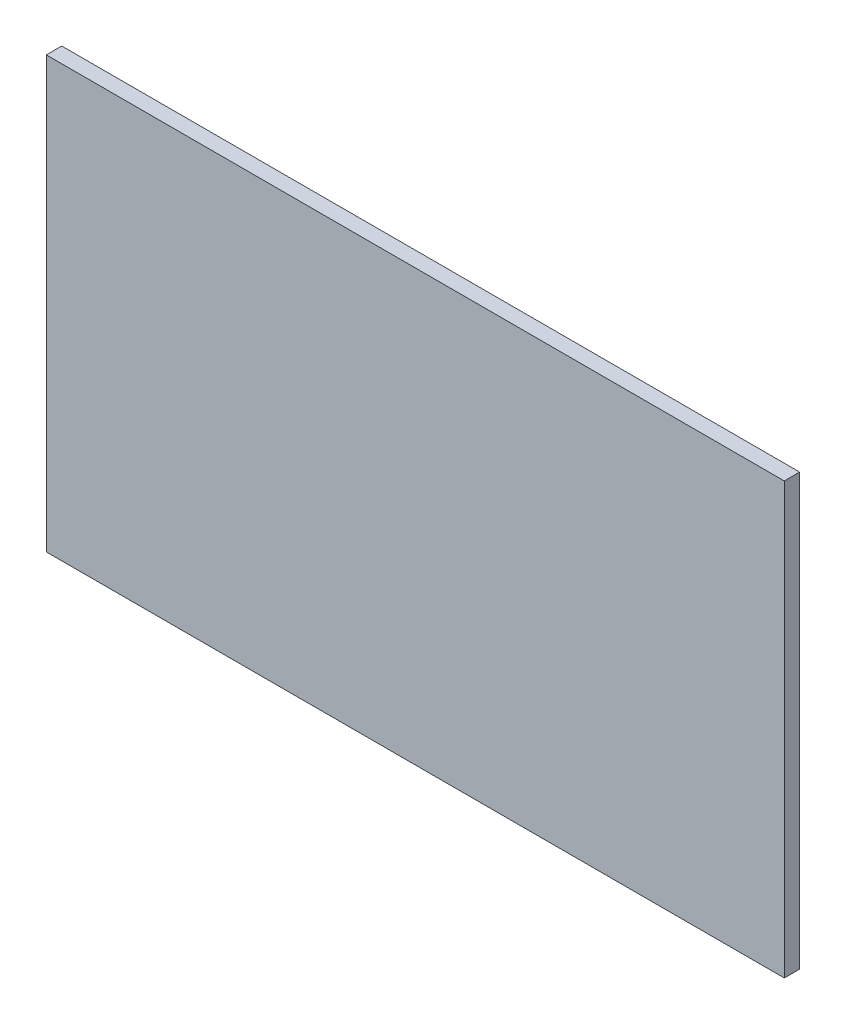
ISO-10303-21;
HEADER;
FILE_DESCRIPTION(('STEP AP214'),'2;1');
FILE_NAME('part.step','',(''),(''),'','','');
FILE_SCHEMA(('AUTOMOTIVE_DESIGN { 1 0 10303 214 1 1 1 1 }'));
ENDSEC;
DATA;
#1=APPLICATION_CONTEXT('core data for automotive mechanical design processes');
#2=APPLICATION_PROTOCOL_DEFINITION('international standard','automotive_design',2000,#1);
#3=PRODUCT_CONTEXT('',#1,'mechanical');
#4=PRODUCT('Part','Part','',(#3));
#5=PRODUCT_RELATED_PRODUCT_CATEGORY('part','',(#4));
#6=PRODUCT_DEFINITION_FORMATION('','',#4);
#7=PRODUCT_DEFINITION_CONTEXT('part definition',#1,'design');
#8=PRODUCT_DEFINITION('design','',#6,#7);
#9=PRODUCT_DEFINITION_SHAPE('','',#8);
#10=(LENGTH_UNIT() NAMED_UNIT(*) SI_UNIT(.MILLI.,.METRE.));
#11=(NAMED_UNIT(*) PLANE_ANGLE_UNIT() SI_UNIT($,.RADIAN.));
#12=(NAMED_UNIT(*) SI_UNIT($,.STERADIAN.) SOLID_ANGLE_UNIT());
#13=UNCERTAINTY_MEASURE_WITH_UNIT(LENGTH_MEASURE(1.E-05),#10,'distance_accuracy_value','');
#14=(GEOMETRIC_REPRESENTATION_CONTEXT(3) GLOBAL_UNCERTAINTY_ASSIGNED_CONTEXT((#13)) GLOBAL_UNIT_ASSIGNED_CONTEXT((#10,
#11,#12)) REPRESENTATION_CONTEXT('',''));
#15=CARTESIAN_POINT('',(0.,0.,0.));
#16=DIRECTION('',(0.,0.,1.));
#17=DIRECTION('',(1.,0.,0.));
#18=AXIS2_PLACEMENT_3D('',#15,#16,#17);
#19=CARTESIAN_POINT('',(0.,0.,30.));
#20=DIRECTION('',(1.,0.,0.));
#21=DIRECTION('',(0.,0.,-1.));
#22=AXIS2_PLACEMENT_3D('',#19,#20,#21);
#23=PLANE('',#22);
#24=DIRECTION('',(0.,-1.,0.));
#25=VECTOR('',#24,1.);
#26=CARTESIAN_POINT('',(0.,0.,0.));
#27=LINE('',#26,#25);
#28=CARTESIAN_POINT('',(0.,840.,0.));
#29=VERTEX_POINT('',#28);
#30=CARTESIAN_POINT('',(0.,0.,0.));
#31=VERTEX_POINT('',#30);
#32=EDGE_CURVE('E102',#29,#31,#27,.T.);
#33=ORIENTED_EDGE('',*,*,#32,.T.);
#34=DIRECTION('',(0.,0.,-1.));
#35=VECTOR('',#34,1.);
#36=CARTESIAN_POINT('',(0.,0.,30.));
#37=LINE('',#36,#35);
#38=CARTESIAN_POINT('',(0.,0.,30.));
#39=VERTEX_POINT('',#38);
#40=EDGE_CURVE('E11',#39,#31,#37,.T.);
#41=ORIENTED_EDGE('',*,*,#40,.F.);
#42=DIRECTION('',(0.,-1.,0.));
#43=VECTOR('',#42,1.);
#44=CARTESIAN_POINT('',(0.,0.,30.));
#45=LINE('',#44,#43);
#46=CARTESIAN_POINT('',(0.,840.,30.));
#47=VERTEX_POINT('',#46);
#48=EDGE_CURVE('E90',#47,#39,#45,.T.);
#49=ORIENTED_EDGE('',*,*,#48,.F.);
#50=DIRECTION('',(0.,0.,-1.));
#51=VECTOR('',#50,1.);
#52=CARTESIAN_POINT('',(0.,840.,30.));
#53=LINE('',#52,#51);
#54=EDGE_CURVE('E98',#47,#29,#53,.T.);
#55=ORIENTED_EDGE('',*,*,#54,.T.);
#56=EDGE_LOOP('',(#33,#41,#49,#55));
#57=FACE_BOUND('',#56,.T.);
#58=ADVANCED_FACE('F39',(#57),#23,.F.);
#59=CARTESIAN_POINT('',(0.,0.,30.));
#60=DIRECTION('',(0.,1.,0.));
#61=DIRECTION('',(0.,0.,1.));
#62=AXIS2_PLACEMENT_3D('',#59,#60,#61);
#63=PLANE('',#62);
#64=DIRECTION('',(1.,0.,0.));
#65=VECTOR('',#64,1.);
#66=CARTESIAN_POINT('',(0.,0.,0.));
#67=LINE('',#66,#65);
#68=CARTESIAN_POINT('',(1440.,0.,0.));
#69=VERTEX_POINT('',#68);
#70=EDGE_CURVE('E94',#31,#69,#67,.T.);
#71=ORIENTED_EDGE('',*,*,#70,.T.);
#72=DIRECTION('',(0.,0.,-1.));
#73=VECTOR('',#72,1.);
#74=CARTESIAN_POINT('',(1440.,0.,30.));
#75=LINE('',#74,#73);
#76=CARTESIAN_POINT('',(1440.,0.,30.));
#77=VERTEX_POINT('',#76);
#78=EDGE_CURVE('E47',#77,#69,#75,.T.);
#79=ORIENTED_EDGE('',*,*,#78,.F.);
#80=DIRECTION('',(1.,0.,0.));
#81=VECTOR('',#80,1.);
#82=CARTESIAN_POINT('',(0.,0.,30.));
#83=LINE('',#82,#81);
#84=EDGE_CURVE('E85',#39,#77,#83,.T.);
#85=ORIENTED_EDGE('',*,*,#84,.F.);
#86=ORIENTED_EDGE('',*,*,#40,.T.);
#87=EDGE_LOOP('',(#71,#79,#85,#86));
#88=FACE_BOUND('',#87,.T.);
#89=ADVANCED_FACE('F93',(#88),#63,.F.);
#90=CARTESIAN_POINT('',(1440.,0.,30.));
#91=DIRECTION('',(-1.,0.,0.));
#92=DIRECTION('',(0.,0.,1.));
#93=AXIS2_PLACEMENT_3D('',#90,#91,#92);
#94=PLANE('',#93);
#95=DIRECTION('',(0.,1.,0.));
#96=VECTOR('',#95,1.);
#97=CARTESIAN_POINT('',(1440.,0.,0.));
#98=LINE('',#97,#96);
#99=CARTESIAN_POINT('',(1440.,840.,0.));
#100=VERTEX_POINT('',#99);
#101=EDGE_CURVE('E72',#69,#100,#98,.T.);
#102=ORIENTED_EDGE('',*,*,#101,.T.);
#103=DIRECTION('',(0.,0.,-1.));
#104=VECTOR('',#103,1.);
#105=CARTESIAN_POINT('',(1440.,840.,30.));
#106=LINE('',#105,#104);
#107=CARTESIAN_POINT('',(1440.,840.,30.));
#108=VERTEX_POINT('',#107);
#109=EDGE_CURVE('E95',#108,#100,#106,.T.);
#110=ORIENTED_EDGE('',*,*,#109,.F.);
#111=DIRECTION('',(0.,1.,0.));
#112=VECTOR('',#111,1.);
#113=CARTESIAN_POINT('',(1440.,0.,30.));
#114=LINE('',#113,#112);
#115=EDGE_CURVE('E88',#77,#108,#114,.T.);
#116=ORIENTED_EDGE('',*,*,#115,.F.);
#117=ORIENTED_EDGE('',*,*,#78,.T.);
#118=EDGE_LOOP('',(#102,#110,#116,#117));
#119=FACE_BOUND('',#118,.T.);
#120=ADVANCED_FACE('F96',(#119),#94,.F.);
#121=CARTESIAN_POINT('',(0.,840.,30.));
#122=DIRECTION('',(0.,-1.,0.));
#123=DIRECTION('',(0.,0.,-1.));
#124=AXIS2_PLACEMENT_3D('',#121,#122,#123);
#125=PLANE('',#124);
#126=DIRECTION('',(-1.,0.,0.));
#127=VECTOR('',#126,1.);
#128=CARTESIAN_POINT('',(0.,840.,0.));
#129=LINE('',#128,#127);
#130=EDGE_CURVE('E78',#100,#29,#129,.T.);
#131=ORIENTED_EDGE('',*,*,#130,.T.);
#132=ORIENTED_EDGE('',*,*,#54,.F.);
#133=DIRECTION('',(-1.,0.,0.));
#134=VECTOR('',#133,1.);
#135=CARTESIAN_POINT('',(0.,840.,30.));
#136=LINE('',#135,#134);
#137=EDGE_CURVE('E55',#108,#47,#136,.T.);
#138=ORIENTED_EDGE('',*,*,#137,.F.);
#139=ORIENTED_EDGE('',*,*,#109,.T.);
#140=EDGE_LOOP('',(#131,#132,#138,#139));
#141=FACE_BOUND('',#140,.T.);
#142=ADVANCED_FACE('F109',(#141),#125,.F.);
#143=CARTESIAN_POINT('',(0.,0.,30.));
#144=DIRECTION('',(0.,0.,-1.));
#145=DIRECTION('',(-1.,0.,0.));
#146=AXIS2_PLACEMENT_3D('',#143,#144,#145);
#147=PLANE('',#146);
#148=ORIENTED_EDGE('',*,*,#48,.T.);
#149=ORIENTED_EDGE('',*,*,#84,.T.);
#150=ORIENTED_EDGE('',*,*,#115,.T.);
#151=ORIENTED_EDGE('',*,*,#137,.T.);
#152=EDGE_LOOP('',(#148,#149,#150,#151));
#153=FACE_BOUND('',#152,.T.);
#154=ADVANCED_FACE('F86',(#153),#147,.F.);
#155=CARTESIAN_POINT('',(0.,0.,0.));
#156=DIRECTION('',(0.,0.,-1.));
#157=DIRECTION('',(-1.,0.,0.));
#158=AXIS2_PLACEMENT_3D('',#155,#156,#157);
#159=PLANE('',#158);
#160=ORIENTED_EDGE('',*,*,#32,.F.);
#161=ORIENTED_EDGE('',*,*,#130,.F.);
#162=ORIENTED_EDGE('',*,*,#101,.F.);
#163=ORIENTED_EDGE('',*,*,#70,.F.);
#164=EDGE_LOOP('',(#160,#161,#162,#163));
#165=FACE_BOUND('',#164,.T.);
#166=ADVANCED_FACE('F112',(#165),#159,.T.);
#167=CLOSED_SHELL('',(#58,#89,#120,#142,#154,#166));
#168=MANIFOLD_SOLID_BREP('B2',#167);
#169=ADVANCED_BREP_SHAPE_REPRESENTATION('',(#18,#168),#14);
#170=SHAPE_DEFINITION_REPRESENTATION(#9,#169);
ENDSEC;
END-ISO-10303-21;
